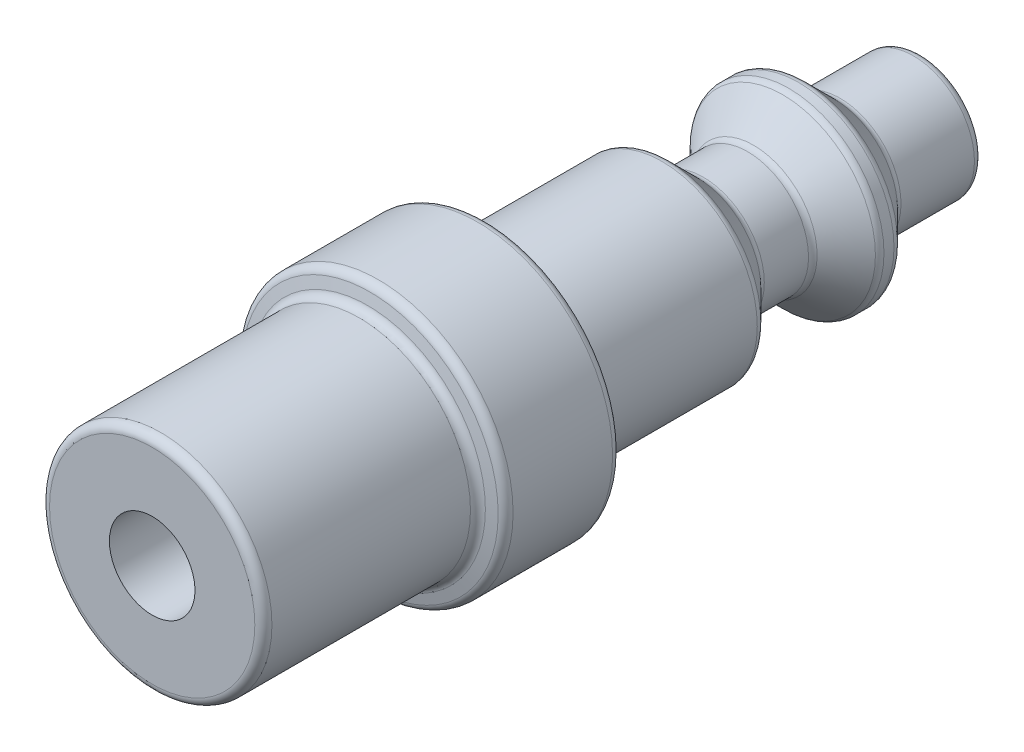
ISO-10303-21;
HEADER;
FILE_DESCRIPTION(('STEP AP214'),'2;1');
FILE_NAME('part.step','',(''),(''),'','','');
FILE_SCHEMA(('AUTOMOTIVE_DESIGN { 1 0 10303 214 1 1 1 1 }'));
ENDSEC;
DATA;
#1=APPLICATION_CONTEXT('core data for automotive mechanical design processes');
#2=APPLICATION_PROTOCOL_DEFINITION('international standard','automotive_design',2000,#1);
#3=PRODUCT_CONTEXT('',#1,'mechanical');
#4=PRODUCT('Part','Part','',(#3));
#5=PRODUCT_RELATED_PRODUCT_CATEGORY('part','',(#4));
#6=PRODUCT_DEFINITION_FORMATION('','',#4);
#7=PRODUCT_DEFINITION_CONTEXT('part definition',#1,'design');
#8=PRODUCT_DEFINITION('design','',#6,#7);
#9=PRODUCT_DEFINITION_SHAPE('','',#8);
#10=(LENGTH_UNIT() NAMED_UNIT(*) SI_UNIT(.MILLI.,.METRE.));
#11=(NAMED_UNIT(*) PLANE_ANGLE_UNIT() SI_UNIT($,.RADIAN.));
#12=(NAMED_UNIT(*) SI_UNIT($,.STERADIAN.) SOLID_ANGLE_UNIT());
#13=UNCERTAINTY_MEASURE_WITH_UNIT(LENGTH_MEASURE(1.E-05),#10,'distance_accuracy_value','');
#14=(GEOMETRIC_REPRESENTATION_CONTEXT(3) GLOBAL_UNCERTAINTY_ASSIGNED_CONTEXT((#13)) GLOBAL_UNIT_ASSIGNED_CONTEXT((#10,
#11,#12)) REPRESENTATION_CONTEXT('',''));
#15=CARTESIAN_POINT('',(0.,0.,0.));
#16=DIRECTION('',(0.,0.,1.));
#17=DIRECTION('',(1.,0.,0.));
#18=AXIS2_PLACEMENT_3D('',#15,#16,#17);
#19=CARTESIAN_POINT('',(0.,0.,7.99580693019013));
#20=DIRECTION('',(0.,0.,-1.));
#21=DIRECTION('',(-1.,0.,0.));
#22=AXIS2_PLACEMENT_3D('',#19,#20,#21);
#23=CONICAL_SURFACE('',#22,5.56374446089535,0.786447530482505);
#24=CARTESIAN_POINT('',(0.,0.,8.14231693281503));
#25=DIRECTION('',(0.,0.,1.));
#26=DIRECTION('',(1.,0.,0.));
#27=AXIS2_PLACEMENT_3D('',#24,#25,#26);
#28=CIRCLE('',#27,5.41692664960441);
#29=CARTESIAN_POINT('',(5.41692664960441,0.,8.14231693281503));
#30=VERTEX_POINT('',#29);
#31=EDGE_CURVE('E111',#30,#30,#28,.T.);
#32=ORIENTED_EDGE('',*,*,#31,.T.);
#33=EDGE_LOOP('',(#32));
#34=FACE_BOUND('',#33,.T.);
#35=CARTESIAN_POINT('',(0.,0.,9.84510385775535));
#36=DIRECTION('',(0.,0.,-1.));
#37=DIRECTION('',(-1.,0.,0.));
#38=AXIS2_PLACEMENT_3D('',#35,#36,#37);
#39=CIRCLE('',#38,3.71056227218628);
#40=CARTESIAN_POINT('',(-3.71056227218628,0.,9.84510385775535));
#41=VERTEX_POINT('',#40);
#42=EDGE_CURVE('E114',#41,#41,#39,.T.);
#43=ORIENTED_EDGE('',*,*,#42,.T.);
#44=EDGE_LOOP('',(#43));
#45=FACE_BOUND('',#44,.T.);
#46=ADVANCED_FACE('F37',(#34,#45),#23,.T.);
#47=CARTESIAN_POINT('',(0.,0.,45.));
#48=DIRECTION('',(0.,0.,1.));
#49=DIRECTION('',(1.,0.,0.));
#50=AXIS2_PLACEMENT_3D('',#47,#48,#49);
#51=CYLINDRICAL_SURFACE('',#50,3.56374446089535);
#52=CARTESIAN_POINT('',(0.,0.,12.7841996598505));
#53=DIRECTION('',(0.,0.,1.));
#54=DIRECTION('',(1.,0.,0.));
#55=AXIS2_PLACEMENT_3D('',#52,#53,#54);
#56=CIRCLE('',#55,3.56374446089535);
#57=CARTESIAN_POINT('',(3.56374446089535,0.,12.7841996598505));
#58=VERTEX_POINT('',#57);
#59=EDGE_CURVE('E44',#58,#58,#56,.F.);
#60=ORIENTED_EDGE('',*,*,#59,.T.);
#61=EDGE_LOOP('',(#60));
#62=FACE_BOUND('',#61,.T.);
#63=CARTESIAN_POINT('',(0.,0.,10.19902806091));
#64=DIRECTION('',(0.,0.,1.));
#65=DIRECTION('',(1.,0.,0.));
#66=AXIS2_PLACEMENT_3D('',#63,#64,#65);
#67=CIRCLE('',#66,3.56374446089535);
#68=CARTESIAN_POINT('',(3.56374446089535,0.,10.19902806091));
#69=VERTEX_POINT('',#68);
#70=EDGE_CURVE('E48',#69,#69,#67,.T.);
#71=ORIENTED_EDGE('',*,*,#70,.T.);
#72=EDGE_LOOP('',(#71));
#73=FACE_BOUND('',#72,.T.);
#74=ADVANCED_FACE('F150',(#62,#73),#51,.T.);
#75=CARTESIAN_POINT('',(0.,0.,12.9916138603803));
#76=DIRECTION('',(0.,0.,1.));
#77=DIRECTION('',(1.,0.,0.));
#78=AXIS2_PLACEMENT_3D('',#75,#76,#77);
#79=CONICAL_SURFACE('',#78,3.56374446089535,0.786447530482505);
#80=CARTESIAN_POINT('',(0.,0.,14.8409107879455));
#81=DIRECTION('',(0.,0.,-1.));
#82=DIRECTION('',(-1.,0.,0.));
#83=AXIS2_PLACEMENT_3D('',#80,#81,#82);
#84=CIRCLE('',#83,5.41692664960441);
#85=CARTESIAN_POINT('',(-5.41692664960441,0.,14.8409107879455));
#86=VERTEX_POINT('',#85);
#87=EDGE_CURVE('E52',#86,#86,#84,.T.);
#88=ORIENTED_EDGE('',*,*,#87,.T.);
#89=EDGE_LOOP('',(#88));
#90=FACE_BOUND('',#89,.T.);
#91=CARTESIAN_POINT('',(0.,0.,13.1381238630052));
#92=DIRECTION('',(0.,0.,1.));
#93=DIRECTION('',(1.,0.,0.));
#94=AXIS2_PLACEMENT_3D('',#91,#92,#93);
#95=CIRCLE('',#94,3.71056227218628);
#96=CARTESIAN_POINT('',(3.71056227218628,0.,13.1381238630052));
#97=VERTEX_POINT('',#96);
#98=EDGE_CURVE('E57',#97,#97,#95,.T.);
#99=ORIENTED_EDGE('',*,*,#98,.T.);
#100=EDGE_LOOP('',(#99));
#101=FACE_BOUND('',#100,.T.);
#102=ADVANCED_FACE('F156',(#90,#101),#79,.T.);
#103=CARTESIAN_POINT('',(0.,0.,45.));
#104=DIRECTION('',(0.,0.,1.));
#105=DIRECTION('',(1.,0.,0.));
#106=AXIS2_PLACEMENT_3D('',#103,#104,#105);
#107=CYLINDRICAL_SURFACE('',#106,5.56374446089534);
#108=CARTESIAN_POINT('',(0.,0.,24.5986161840766));
#109=DIRECTION('',(0.,0.,1.));
#110=DIRECTION('',(1.,0.,0.));
#111=AXIS2_PLACEMENT_3D('',#108,#109,#110);
#112=CIRCLE('',#111,5.56374446089534);
#113=CARTESIAN_POINT('',(5.56374446089534,0.,24.5986161840766));
#114=VERTEX_POINT('',#113);
#115=EDGE_CURVE('E60',#114,#114,#112,.F.);
#116=ORIENTED_EDGE('',*,*,#115,.T.);
#117=EDGE_LOOP('',(#116));
#118=FACE_BOUND('',#117,.T.);
#119=CARTESIAN_POINT('',(0.,0.,15.1948349911002));
#120=DIRECTION('',(0.,0.,-1.));
#121=DIRECTION('',(-1.,0.,0.));
#122=AXIS2_PLACEMENT_3D('',#119,#120,#121);
#123=CIRCLE('',#122,5.56374446089534);
#124=CARTESIAN_POINT('',(-5.56374446089534,0.,15.1948349911002));
#125=VERTEX_POINT('',#124);
#126=EDGE_CURVE('E63',#125,#125,#123,.F.);
#127=ORIENTED_EDGE('',*,*,#126,.T.);
#128=EDGE_LOOP('',(#127));
#129=FACE_BOUND('',#128,.T.);
#130=ADVANCED_FACE('F235',(#118,#129),#107,.T.);
#131=CARTESIAN_POINT('',(0.,0.,24.9874207905704));
#132=DIRECTION('',(0.,0.,1.));
#133=DIRECTION('',(1.,0.,0.));
#134=AXIS2_PLACEMENT_3D('',#131,#132,#133);
#135=CONICAL_SURFACE('',#134,5.56374446089535,1.32187626287963);
#136=CARTESIAN_POINT('',(0.,0.,25.4791382934745));
#137=DIRECTION('',(0.,0.,-1.));
#138=DIRECTION('',(-1.,0.,0.));
#139=AXIS2_PLACEMENT_3D('',#136,#137,#138);
#140=CIRCLE('',#139,7.49817872585093);
#141=CARTESIAN_POINT('',(-7.49817872585093,0.,25.4791382934745));
#142=VERTEX_POINT('',#141);
#143=EDGE_CURVE('E66',#142,#142,#140,.T.);
#144=ORIENTED_EDGE('',*,*,#143,.T.);
#145=EDGE_LOOP('',(#144));
#146=FACE_BOUND('',#145,.T.);
#147=CARTESIAN_POINT('',(0.,0.,25.0832057026361));
#148=DIRECTION('',(0.,0.,1.));
#149=DIRECTION('',(1.,0.,0.));
#150=AXIS2_PLACEMENT_3D('',#147,#148,#149);
#151=CIRCLE('',#150,5.94056573504441);
#152=CARTESIAN_POINT('',(5.94056573504441,0.,25.0832057026361));
#153=VERTEX_POINT('',#152);
#154=EDGE_CURVE('E69',#153,#153,#151,.T.);
#155=ORIENTED_EDGE('',*,*,#154,.T.);
#156=EDGE_LOOP('',(#155));
#157=FACE_BOUND('',#156,.T.);
#158=ADVANCED_FACE('F226',(#146,#157),#135,.T.);
#159=CARTESIAN_POINT('',(0.,0.,45.));
#160=DIRECTION('',(0.,0.,1.));
#161=DIRECTION('',(1.,0.,0.));
#162=AXIS2_PLACEMENT_3D('',#159,#160,#161);
#163=CYLINDRICAL_SURFACE('',#162,3.56374446089535);
#164=CARTESIAN_POINT('',(0.,0.,4.79258579947021));
#165=DIRECTION('',(0.,0.,1.));
#166=DIRECTION('',(1.,0.,0.));
#167=AXIS2_PLACEMENT_3D('',#164,#165,#166);
#168=CIRCLE('',#167,3.56374446089535);
#169=CARTESIAN_POINT('',(3.56374446089535,0.,4.79258579947021));
#170=VERTEX_POINT('',#169);
#171=EDGE_CURVE('E93',#170,#170,#168,.F.);
#172=ORIENTED_EDGE('',*,*,#171,.T.);
#173=EDGE_LOOP('',(#172));
#174=FACE_BOUND('',#173,.T.);
#175=CARTESIAN_POINT('',(0.,0.,0.5));
#176=DIRECTION('',(0.,0.,1.));
#177=DIRECTION('',(1.,0.,0.));
#178=AXIS2_PLACEMENT_3D('',#175,#176,#177);
#179=CIRCLE('',#178,3.56374446089535);
#180=CARTESIAN_POINT('',(3.56374446089535,0.,0.5));
#181=VERTEX_POINT('',#180);
#182=EDGE_CURVE('E96',#181,#181,#179,.T.);
#183=ORIENTED_EDGE('',*,*,#182,.T.);
#184=EDGE_LOOP('',(#183));
#185=FACE_BOUND('',#184,.T.);
#186=ADVANCED_FACE('F224',(#174,#185),#163,.T.);
#187=CARTESIAN_POINT('',(0.,0.,5.));
#188=DIRECTION('',(0.,0.,1.));
#189=DIRECTION('',(1.,0.,0.));
#190=AXIS2_PLACEMENT_3D('',#187,#188,#189);
#191=CONICAL_SURFACE('',#190,3.56374446089535,0.786447530482503);
#192=CARTESIAN_POINT('',(0.,0.,6.84929692756523));
#193=DIRECTION('',(0.,0.,-1.));
#194=DIRECTION('',(-1.,0.,0.));
#195=AXIS2_PLACEMENT_3D('',#192,#193,#194);
#196=CIRCLE('',#195,5.41692664960441);
#197=CARTESIAN_POINT('',(-5.41692664960441,0.,6.84929692756523));
#198=VERTEX_POINT('',#197);
#199=EDGE_CURVE('E99',#198,#198,#196,.T.);
#200=ORIENTED_EDGE('',*,*,#199,.T.);
#201=EDGE_LOOP('',(#200));
#202=FACE_BOUND('',#201,.T.);
#203=CARTESIAN_POINT('',(0.,0.,5.1465100026249));
#204=DIRECTION('',(0.,0.,1.));
#205=DIRECTION('',(1.,0.,0.));
#206=AXIS2_PLACEMENT_3D('',#203,#204,#205);
#207=CIRCLE('',#206,3.71056227218628);
#208=CARTESIAN_POINT('',(3.71056227218628,0.,5.1465100026249));
#209=VERTEX_POINT('',#208);
#210=EDGE_CURVE('E102',#209,#209,#207,.T.);
#211=ORIENTED_EDGE('',*,*,#210,.T.);
#212=EDGE_LOOP('',(#211));
#213=FACE_BOUND('',#212,.T.);
#214=ADVANCED_FACE('F145',(#202,#213),#191,.T.);
#215=CARTESIAN_POINT('',(0.,0.,45.));
#216=DIRECTION('',(0.,0.,1.));
#217=DIRECTION('',(1.,0.,0.));
#218=AXIS2_PLACEMENT_3D('',#215,#216,#217);
#219=CYLINDRICAL_SURFACE('',#218,5.56374446089534);
#220=CARTESIAN_POINT('',(0.,0.,7.78839272966034));
#221=DIRECTION('',(0.,0.,-1.));
#222=DIRECTION('',(-1.,0.,0.));
#223=AXIS2_PLACEMENT_3D('',#220,#221,#222);
#224=CIRCLE('',#223,5.56374446089534);
#225=CARTESIAN_POINT('',(-5.56374446089534,0.,7.78839272966034));
#226=VERTEX_POINT('',#225);
#227=EDGE_CURVE('E105',#226,#226,#224,.T.);
#228=ORIENTED_EDGE('',*,*,#227,.T.);
#229=EDGE_LOOP('',(#228));
#230=FACE_BOUND('',#229,.T.);
#231=CARTESIAN_POINT('',(0.,0.,7.20322113071991));
#232=DIRECTION('',(0.,0.,-1.));
#233=DIRECTION('',(-1.,0.,0.));
#234=AXIS2_PLACEMENT_3D('',#231,#232,#233);
#235=CIRCLE('',#234,5.56374446089534);
#236=CARTESIAN_POINT('',(-5.56374446089534,0.,7.20322113071991));
#237=VERTEX_POINT('',#236);
#238=EDGE_CURVE('E108',#237,#237,#235,.F.);
#239=ORIENTED_EDGE('',*,*,#238,.T.);
#240=EDGE_LOOP('',(#239));
#241=FACE_BOUND('',#240,.T.);
#242=ADVANCED_FACE('F136',(#230,#241),#219,.T.);
#243=CARTESIAN_POINT('',(0.,0.,0.));
#244=DIRECTION('',(0.,0.,1.));
#245=DIRECTION('',(1.,0.,0.));
#246=AXIS2_PLACEMENT_3D('',#243,#244,#245);
#247=PLANE('',#246);
#248=CARTESIAN_POINT('',(0.,0.,0.));
#249=DIRECTION('',(0.,0.,1.));
#250=DIRECTION('',(1.,0.,0.));
#251=AXIS2_PLACEMENT_3D('',#248,#249,#250);
#252=CIRCLE('',#251,3.06374446089535);
#253=CARTESIAN_POINT('',(3.06374446089535,0.,0.));
#254=VERTEX_POINT('',#253);
#255=EDGE_CURVE('E10',#254,#254,#252,.F.);
#256=ORIENTED_EDGE('',*,*,#255,.T.);
#257=EDGE_LOOP('',(#256));
#258=FACE_BOUND('',#257,.T.);
#259=CARTESIAN_POINT('',(0.,0.,0.));
#260=DIRECTION('',(0.,0.,-1.));
#261=DIRECTION('',(-1.,0.,0.));
#262=AXIS2_PLACEMENT_3D('',#259,#260,#261);
#263=CIRCLE('',#262,2.5);
#264=CARTESIAN_POINT('',(-2.5,0.,0.));
#265=VERTEX_POINT('',#264);
#266=EDGE_CURVE('E118',#265,#265,#263,.T.);
#267=ORIENTED_EDGE('',*,*,#266,.F.);
#268=EDGE_LOOP('',(#267));
#269=FACE_BOUND('',#268,.T.);
#270=ADVANCED_FACE('F133',(#258,#269),#247,.F.);
#271=CARTESIAN_POINT('',(0.,0.,45.));
#272=DIRECTION('',(0.,0.,-1.));
#273=DIRECTION('',(-1.,0.,0.));
#274=AXIS2_PLACEMENT_3D('',#271,#272,#273);
#275=CYLINDRICAL_SURFACE('',#274,7.875);
#276=CARTESIAN_POINT('',(0.,0.,31.7793493919796));
#277=DIRECTION('',(0.,0.,-1.));
#278=DIRECTION('',(-1.,0.,0.));
#279=AXIS2_PLACEMENT_3D('',#276,#277,#278);
#280=CIRCLE('',#279,7.875);
#281=CARTESIAN_POINT('',(-7.875,0.,31.7793493919796));
#282=VERTEX_POINT('',#281);
#283=EDGE_CURVE('E72',#282,#282,#280,.T.);
#284=CARTESIAN_POINT('',(0.,0.,25.963727812034));
#285=DIRECTION('',(0.,0.,-1.));
#286=DIRECTION('',(-1.,0.,0.));
#287=AXIS2_PLACEMENT_3D('',#284,#285,#286);
#288=CIRCLE('',#287,7.875);
#289=CARTESIAN_POINT('',(-7.875,0.,25.963727812034));
#290=VERTEX_POINT('',#289);
#291=EDGE_CURVE('E75',#290,#290,#288,.F.);
#292=CARTESIAN_POINT('',(-7.875,0.,31.7793493919796));
#293=CARTESIAN_POINT('',(-7.875,0.,31.7187700005219));
#294=CARTESIAN_POINT('',(-7.875,0.,31.6581906090641));
#295=CARTESIAN_POINT('',(-7.875,0.,31.5370318261486));
#296=CARTESIAN_POINT('',(-7.875,0.,31.4764524346908));
#297=CARTESIAN_POINT('',(-7.875,0.,31.3552936517753));
#298=CARTESIAN_POINT('',(-7.875,0.,31.2947142603175));
#299=CARTESIAN_POINT('',(-7.875,0.,31.173555477402));
#300=CARTESIAN_POINT('',(-7.875,0.,31.1129760859442));
#301=CARTESIAN_POINT('',(-7.875,0.,30.9918173030287));
#302=CARTESIAN_POINT('',(-7.875,0.,30.9312379115709));
#303=CARTESIAN_POINT('',(-7.875,0.,30.8100791286554));
#304=CARTESIAN_POINT('',(-7.875,0.,30.7494997371976));
#305=CARTESIAN_POINT('',(-7.875,0.,30.6283409542821));
#306=CARTESIAN_POINT('',(-7.875,0.,30.5677615628243));
#307=CARTESIAN_POINT('',(-7.875,0.,30.4466027799088));
#308=CARTESIAN_POINT('',(-7.875,0.,30.386023388451));
#309=CARTESIAN_POINT('',(-7.875,0.,30.2648646055355));
#310=CARTESIAN_POINT('',(-7.875,0.,30.2042852140777));
#311=CARTESIAN_POINT('',(-7.875,0.,30.0831264311622));
#312=CARTESIAN_POINT('',(-7.875,0.,30.0225470397044));
#313=CARTESIAN_POINT('',(-7.875,0.,29.9013882567889));
#314=CARTESIAN_POINT('',(-7.875,0.,29.8408088653311));
#315=CARTESIAN_POINT('',(-7.875,0.,29.7196500824156));
#316=CARTESIAN_POINT('',(-7.875,0.,29.6590706909578));
#317=CARTESIAN_POINT('',(-7.875,0.,29.5379119080423));
#318=CARTESIAN_POINT('',(-7.875,0.,29.4773325165845));
#319=CARTESIAN_POINT('',(-7.875,0.,29.356173733669));
#320=CARTESIAN_POINT('',(-7.875,0.,29.2955943422112));
#321=CARTESIAN_POINT('',(-7.875,0.,29.1744355592957));
#322=CARTESIAN_POINT('',(-7.875,0.,29.1138561678379));
#323=CARTESIAN_POINT('',(-7.875,0.,28.9926973849224));
#324=CARTESIAN_POINT('',(-7.875,0.,28.9321179934646));
#325=CARTESIAN_POINT('',(-7.875,0.,28.8109592105491));
#326=CARTESIAN_POINT('',(-7.875,0.,28.7503798190913));
#327=CARTESIAN_POINT('',(-7.875,0.,28.6292210361758));
#328=CARTESIAN_POINT('',(-7.875,0.,28.568641644718));
#329=CARTESIAN_POINT('',(-7.875,0.,28.4474828618025));
#330=CARTESIAN_POINT('',(-7.875,0.,28.3869034703447));
#331=CARTESIAN_POINT('',(-7.875,0.,28.2657446874292));
#332=CARTESIAN_POINT('',(-7.875,0.,28.2051652959714));
#333=CARTESIAN_POINT('',(-7.875,0.,28.0840065130559));
#334=CARTESIAN_POINT('',(-7.875,0.,28.0234271215981));
#335=CARTESIAN_POINT('',(-7.875,0.,27.9022683386826));
#336=CARTESIAN_POINT('',(-7.875,0.,27.8416889472248));
#337=CARTESIAN_POINT('',(-7.875,0.,27.7205301643093));
#338=CARTESIAN_POINT('',(-7.875,0.,27.6599507728515));
#339=CARTESIAN_POINT('',(-7.875,0.,27.538791989936));
#340=CARTESIAN_POINT('',(-7.875,0.,27.4782125984782));
#341=CARTESIAN_POINT('',(-7.875,0.,27.3570538155627));
#342=CARTESIAN_POINT('',(-7.875,0.,27.2964744241049));
#343=CARTESIAN_POINT('',(-7.875,0.,27.1753156411894));
#344=CARTESIAN_POINT('',(-7.875,0.,27.1147362497316));
#345=CARTESIAN_POINT('',(-7.875,0.,26.9935774668161));
#346=CARTESIAN_POINT('',(-7.875,0.,26.9329980753583));
#347=CARTESIAN_POINT('',(-7.875,0.,26.8118392924428));
#348=CARTESIAN_POINT('',(-7.875,0.,26.751259900985));
#349=CARTESIAN_POINT('',(-7.875,0.,26.6301011180695));
#350=CARTESIAN_POINT('',(-7.875,0.,26.5695217266117));
#351=CARTESIAN_POINT('',(-7.875,0.,26.4483629436962));
#352=CARTESIAN_POINT('',(-7.875,0.,26.3877835522384));
#353=CARTESIAN_POINT('',(-7.875,0.,26.2666247693229));
#354=CARTESIAN_POINT('',(-7.875,0.,26.2060453778651));
#355=CARTESIAN_POINT('',(-7.875,0.,26.0848865949496));
#356=CARTESIAN_POINT('',(-7.875,0.,26.0243072034918));
#357=CARTESIAN_POINT('',(-7.875,0.,25.963727812034));
#358=B_SPLINE_CURVE_WITH_KNOTS('',3,(#292,#293,#294,#295,#296,#297,#298,#299,#300,#301,#302,
#303,#304,#305,#306,#307,#308,#309,#310,#311,#312,#313,#314,#315,#316,#317,#318,#319,#320,#321,
#322,#323,#324,#325,#326,#327,#328,#329,#330,#331,#332,#333,#334,#335,#336,#337,#338,#339,#340,
#341,#342,#343,#344,#345,#346,#347,#348,#349,#350,#351,#352,#353,#354,#355,#356,#357),
.UNSPECIFIED.,.F.,.F.,(4,2,2,2,2,2,2,2,2,2,2,2,2,2,2,2,2,2,2,2,2,2,2,2,2,2,2,2,2,2,2,2,4),(0.,
0.181738174373301,0.363476348746603,0.545214523119904,0.726952697493202,0.908690871866499,
1.0904290462398,1.2721672206131,1.4539053949864,1.6356435693597,1.817381743733,1.9991199181063,
2.1808580924796,2.3625962668529,2.5443344412262,2.7260726155995,2.9078107899728,3.0895489643461,
3.2712871387194,3.4530253130927,3.634763487466,3.8165016618393,3.9982398362126,4.1799780105859,
4.36171618495919,4.5434543593325,4.72519253370579,4.9069307080791,5.0886688824524,
5.27040705682569,5.452145231199,5.63388340557229,5.81562157994559),.UNSPECIFIED.);
#359=EDGE_CURVE('BSEAM135',#282,#290,#358,.T.);
#360=ORIENTED_EDGE('',*,*,#283,.T.);
#361=ORIENTED_EDGE('',*,*,#291,.T.);
#362=ORIENTED_EDGE('',*,*,#359,.T.);
#363=ORIENTED_EDGE('',*,*,#359,.F.);
#364=EDGE_LOOP('',(#360,#362,#361,#363));
#365=FACE_BOUND('',#364,.T.);
#366=ADVANCED_FACE('F135',(#365),#275,.T.);
#367=CARTESIAN_POINT('',(0.,0.,45.));
#368=DIRECTION('',(0.,0.,1.));
#369=DIRECTION('',(1.,0.,0.));
#370=AXIS2_PLACEMENT_3D('',#367,#368,#369);
#371=CYLINDRICAL_SURFACE('',#370,6.5);
#372=CARTESIAN_POINT('',(0.,0.,44.5));
#373=DIRECTION('',(0.,0.,1.));
#374=DIRECTION('',(1.,0.,0.));
#375=AXIS2_PLACEMENT_3D('',#372,#373,#374);
#376=CIRCLE('',#375,6.5);
#377=CARTESIAN_POINT('',(6.5,0.,44.5));
#378=VERTEX_POINT('',#377);
#379=EDGE_CURVE('E84',#378,#378,#376,.F.);
#380=ORIENTED_EDGE('',*,*,#379,.T.);
#381=EDGE_LOOP('',(#380));
#382=FACE_BOUND('',#381,.T.);
#383=CARTESIAN_POINT('',(0.,0.,32.8955738135606));
#384=DIRECTION('',(0.,0.,1.));
#385=DIRECTION('',(1.,0.,0.));
#386=AXIS2_PLACEMENT_3D('',#383,#384,#385);
#387=CIRCLE('',#386,6.5);
#388=CARTESIAN_POINT('',(6.5,0.,32.8955738135606));
#389=VERTEX_POINT('',#388);
#390=EDGE_CURVE('E87',#389,#389,#387,.T.);
#391=ORIENTED_EDGE('',*,*,#390,.T.);
#392=EDGE_LOOP('',(#391));
#393=FACE_BOUND('',#392,.T.);
#394=ADVANCED_FACE('F142',(#382,#393),#371,.T.);
#395=CARTESIAN_POINT('',(0.,0.,32.1749232055403));
#396=DIRECTION('',(0.,0.,-1.));
#397=DIRECTION('',(-1.,0.,0.));
#398=AXIS2_PLACEMENT_3D('',#395,#396,#397);
#399=CONICAL_SURFACE('',#398,7.875,1.33863959401122);
#400=CARTESIAN_POINT('',(0.,0.,32.4089875914178));
#401=DIRECTION('',(0.,0.,-1.));
#402=DIRECTION('',(-1.,0.,0.));
#403=AXIS2_PLACEMENT_3D('',#400,#401,#402);
#404=CIRCLE('',#403,6.88496153503821);
#405=CARTESIAN_POINT('',(-6.88496153503821,0.,32.4089875914178));
#406=VERTEX_POINT('',#405);
#407=EDGE_CURVE('E78',#406,#406,#404,.T.);
#408=ORIENTED_EDGE('',*,*,#407,.T.);
#409=EDGE_LOOP('',(#408));
#410=FACE_BOUND('',#409,.T.);
#411=CARTESIAN_POINT('',(0.,0.,32.2659356141225));
#412=DIRECTION('',(0.,0.,1.));
#413=DIRECTION('',(1.,0.,0.));
#414=AXIS2_PLACEMENT_3D('',#411,#412,#413);
#415=CIRCLE('',#414,7.49003846496179);
#416=CARTESIAN_POINT('',(7.49003846496179,0.,32.2659356141225));
#417=VERTEX_POINT('',#416);
#418=EDGE_CURVE('E81',#417,#417,#415,.T.);
#419=ORIENTED_EDGE('',*,*,#418,.T.);
#420=EDGE_LOOP('',(#419));
#421=FACE_BOUND('',#420,.T.);
#422=ADVANCED_FACE('F161',(#410,#421),#399,.T.);
#423=CARTESIAN_POINT('',(0.,0.,45.));
#424=DIRECTION('',(0.,0.,1.));
#425=DIRECTION('',(1.,0.,0.));
#426=AXIS2_PLACEMENT_3D('',#423,#424,#425);
#427=PLANE('',#426);
#428=CARTESIAN_POINT('',(0.,0.,45.));
#429=DIRECTION('',(0.,0.,1.));
#430=DIRECTION('',(1.,0.,0.));
#431=AXIS2_PLACEMENT_3D('',#428,#429,#430);
#432=CIRCLE('',#431,6.);
#433=CARTESIAN_POINT('',(6.,0.,45.));
#434=VERTEX_POINT('',#433);
#435=EDGE_CURVE('E90',#434,#434,#432,.T.);
#436=ORIENTED_EDGE('',*,*,#435,.T.);
#437=EDGE_LOOP('',(#436));
#438=FACE_BOUND('',#437,.T.);
#439=CARTESIAN_POINT('',(0.,0.,45.));
#440=DIRECTION('',(0.,0.,-1.));
#441=DIRECTION('',(-1.,0.,0.));
#442=AXIS2_PLACEMENT_3D('',#439,#440,#441);
#443=CIRCLE('',#442,2.5);
#444=CARTESIAN_POINT('',(-2.5,0.,45.));
#445=VERTEX_POINT('',#444);
#446=EDGE_CURVE('E117',#445,#445,#443,.T.);
#447=ORIENTED_EDGE('',*,*,#446,.T.);
#448=EDGE_LOOP('',(#447));
#449=FACE_BOUND('',#448,.T.);
#450=ADVANCED_FACE('F124',(#438,#449),#427,.T.);
#451=CARTESIAN_POINT('',(0.,0.,45.));
#452=DIRECTION('',(0.,0.,-1.));
#453=DIRECTION('',(-1.,0.,0.));
#454=AXIS2_PLACEMENT_3D('',#451,#452,#453);
#455=CYLINDRICAL_SURFACE('',#454,2.5);
#456=CARTESIAN_POINT('',(-2.5,0.,45.));
#457=CARTESIAN_POINT('',(-2.5,0.,44.53125));
#458=CARTESIAN_POINT('',(-2.5,0.,44.0625));
#459=CARTESIAN_POINT('',(-2.5,0.,43.125));
#460=CARTESIAN_POINT('',(-2.5,0.,42.65625));
#461=CARTESIAN_POINT('',(-2.5,0.,41.71875));
#462=CARTESIAN_POINT('',(-2.5,0.,41.25));
#463=CARTESIAN_POINT('',(-2.5,0.,40.3125));
#464=CARTESIAN_POINT('',(-2.5,0.,39.84375));
#465=CARTESIAN_POINT('',(-2.5,0.,38.90625));
#466=CARTESIAN_POINT('',(-2.5,0.,38.4375));
#467=CARTESIAN_POINT('',(-2.5,0.,37.5));
#468=CARTESIAN_POINT('',(-2.5,0.,37.03125));
#469=CARTESIAN_POINT('',(-2.5,0.,36.09375));
#470=CARTESIAN_POINT('',(-2.5,0.,35.625));
#471=CARTESIAN_POINT('',(-2.5,0.,34.6875));
#472=CARTESIAN_POINT('',(-2.5,0.,34.21875));
#473=CARTESIAN_POINT('',(-2.5,0.,33.28125));
#474=CARTESIAN_POINT('',(-2.5,0.,32.8125));
#475=CARTESIAN_POINT('',(-2.5,0.,31.875));
#476=CARTESIAN_POINT('',(-2.5,0.,31.40625));
#477=CARTESIAN_POINT('',(-2.5,0.,30.46875));
#478=CARTESIAN_POINT('',(-2.5,0.,30.));
#479=CARTESIAN_POINT('',(-2.5,0.,29.0625));
#480=CARTESIAN_POINT('',(-2.5,0.,28.59375));
#481=CARTESIAN_POINT('',(-2.5,0.,27.65625));
#482=CARTESIAN_POINT('',(-2.5,0.,27.1875));
#483=CARTESIAN_POINT('',(-2.5,0.,26.25));
#484=CARTESIAN_POINT('',(-2.5,0.,25.78125));
#485=CARTESIAN_POINT('',(-2.5,0.,24.84375));
#486=CARTESIAN_POINT('',(-2.5,0.,24.375));
#487=CARTESIAN_POINT('',(-2.5,0.,23.4375));
#488=CARTESIAN_POINT('',(-2.5,0.,22.96875));
#489=CARTESIAN_POINT('',(-2.5,0.,22.03125));
#490=CARTESIAN_POINT('',(-2.5,0.,21.5625));
#491=CARTESIAN_POINT('',(-2.5,0.,20.625));
#492=CARTESIAN_POINT('',(-2.5,0.,20.15625));
#493=CARTESIAN_POINT('',(-2.5,0.,19.21875));
#494=CARTESIAN_POINT('',(-2.5,0.,18.75));
#495=CARTESIAN_POINT('',(-2.5,0.,17.8125));
#496=CARTESIAN_POINT('',(-2.5,0.,17.34375));
#497=CARTESIAN_POINT('',(-2.5,0.,16.40625));
#498=CARTESIAN_POINT('',(-2.5,0.,15.9375));
#499=CARTESIAN_POINT('',(-2.5,0.,15.));
#500=CARTESIAN_POINT('',(-2.5,0.,14.53125));
#501=CARTESIAN_POINT('',(-2.5,0.,13.59375));
#502=CARTESIAN_POINT('',(-2.5,0.,13.125));
#503=CARTESIAN_POINT('',(-2.5,0.,12.1875));
#504=CARTESIAN_POINT('',(-2.5,0.,11.71875));
#505=CARTESIAN_POINT('',(-2.5,0.,10.78125));
#506=CARTESIAN_POINT('',(-2.5,0.,10.3125));
#507=CARTESIAN_POINT('',(-2.5,0.,9.37500000000001));
#508=CARTESIAN_POINT('',(-2.5,0.,8.90625000000001));
#509=CARTESIAN_POINT('',(-2.5,0.,7.96875000000001));
#510=CARTESIAN_POINT('',(-2.5,0.,7.50000000000001));
#511=CARTESIAN_POINT('',(-2.5,0.,6.56250000000001));
#512=CARTESIAN_POINT('',(-2.5,0.,6.09375000000001));
#513=CARTESIAN_POINT('',(-2.5,0.,5.15625000000001));
#514=CARTESIAN_POINT('',(-2.5,0.,4.68750000000001));
#515=CARTESIAN_POINT('',(-2.5,0.,3.75000000000001));
#516=CARTESIAN_POINT('',(-2.5,0.,3.28125000000001));
#517=CARTESIAN_POINT('',(-2.5,0.,2.34375000000001));
#518=CARTESIAN_POINT('',(-2.5,0.,1.87500000000001));
#519=CARTESIAN_POINT('',(-2.5,0.,0.937500000000006));
#520=CARTESIAN_POINT('',(-2.5,0.,0.468750000000007));
#521=CARTESIAN_POINT('',(-2.5,0.,0.));
#522=B_SPLINE_CURVE_WITH_KNOTS('',3,(#456,#457,#458,#459,#460,#461,#462,#463,#464,#465,#466,
#467,#468,#469,#470,#471,#472,#473,#474,#475,#476,#477,#478,#479,#480,#481,#482,#483,#484,#485,
#486,#487,#488,#489,#490,#491,#492,#493,#494,#495,#496,#497,#498,#499,#500,#501,#502,#503,#504,
#505,#506,#507,#508,#509,#510,#511,#512,#513,#514,#515,#516,#517,#518,#519,#520,#521),
.UNSPECIFIED.,.F.,.F.,(4,2,2,2,2,2,2,2,2,2,2,2,2,2,2,2,2,2,2,2,2,2,2,2,2,2,2,2,2,2,2,2,4),(0.,
1.40625,2.8125,4.21875,5.62500000000001,7.03125,8.4375,9.84375000000001,11.25,12.65625,14.0625,
15.46875,16.875,18.28125,19.6875,21.09375,22.5,23.90625,25.3125,26.71875,28.125,29.53125,
30.9375,32.34375,33.75,35.15625,36.5625,37.96875,39.375,40.78125,42.1875,43.59375,45.),.UNSPECIFIED.);
#523=EDGE_CURVE('BSEAM126',#445,#265,#522,.T.);
#524=ORIENTED_EDGE('',*,*,#446,.F.);
#525=ORIENTED_EDGE('',*,*,#266,.T.);
#526=ORIENTED_EDGE('',*,*,#523,.T.);
#527=ORIENTED_EDGE('',*,*,#523,.F.);
#528=EDGE_LOOP('',(#524,#526,#525,#527));
#529=FACE_BOUND('',#528,.T.);
#530=ADVANCED_FACE('F126',(#529),#455,.F.);
#531=CARTESIAN_POINT('',(0.,0.,7.78839272966034));
#532=DIRECTION('',(0.,0.,-1.));
#533=DIRECTION('',(-1.,0.,0.));
#534=AXIS2_PLACEMENT_3D('',#531,#532,#533);
#535=TOROIDAL_SURFACE('',#534,5.06374446089534,0.5);
#536=ORIENTED_EDGE('',*,*,#227,.F.);
#537=EDGE_LOOP('',(#536));
#538=FACE_BOUND('',#537,.T.);
#539=ORIENTED_EDGE('',*,*,#31,.F.);
#540=EDGE_LOOP('',(#539));
#541=FACE_BOUND('',#540,.T.);
#542=ADVANCED_FACE('F129',(#538,#541),#535,.T.);
#543=CARTESIAN_POINT('',(0.,0.,7.20322113071991));
#544=DIRECTION('',(0.,0.,-1.));
#545=DIRECTION('',(-1.,0.,0.));
#546=AXIS2_PLACEMENT_3D('',#543,#544,#545);
#547=TOROIDAL_SURFACE('',#546,5.06374446089534,0.5);
#548=ORIENTED_EDGE('',*,*,#199,.F.);
#549=EDGE_LOOP('',(#548));
#550=FACE_BOUND('',#549,.T.);
#551=ORIENTED_EDGE('',*,*,#238,.F.);
#552=EDGE_LOOP('',(#551));
#553=FACE_BOUND('',#552,.T.);
#554=ADVANCED_FACE('F184',(#550,#553),#547,.T.);
#555=CARTESIAN_POINT('',(0.,0.,4.79258579947021));
#556=DIRECTION('',(0.,0.,1.));
#557=DIRECTION('',(1.,0.,0.));
#558=AXIS2_PLACEMENT_3D('',#555,#556,#557);
#559=TOROIDAL_SURFACE('',#558,4.06374446089535,0.5);
#560=ORIENTED_EDGE('',*,*,#171,.F.);
#561=EDGE_LOOP('',(#560));
#562=FACE_BOUND('',#561,.T.);
#563=ORIENTED_EDGE('',*,*,#210,.F.);
#564=EDGE_LOOP('',(#563));
#565=FACE_BOUND('',#564,.T.);
#566=ADVANCED_FACE('F174',(#562,#565),#559,.F.);
#567=CARTESIAN_POINT('',(0.,0.,44.5));
#568=DIRECTION('',(0.,0.,1.));
#569=DIRECTION('',(1.,0.,0.));
#570=AXIS2_PLACEMENT_3D('',#567,#568,#569);
#571=TOROIDAL_SURFACE('',#570,6.,0.5);
#572=ORIENTED_EDGE('',*,*,#379,.F.);
#573=EDGE_LOOP('',(#572));
#574=FACE_BOUND('',#573,.T.);
#575=ORIENTED_EDGE('',*,*,#435,.F.);
#576=EDGE_LOOP('',(#575));
#577=FACE_BOUND('',#576,.T.);
#578=ADVANCED_FACE('F171',(#574,#577),#571,.T.);
#579=CARTESIAN_POINT('',(0.,0.,32.8955738135606));
#580=DIRECTION('',(0.,0.,1.));
#581=DIRECTION('',(1.,0.,0.));
#582=AXIS2_PLACEMENT_3D('',#579,#580,#581);
#583=TOROIDAL_SURFACE('',#582,7.,0.5);
#584=ORIENTED_EDGE('',*,*,#407,.F.);
#585=EDGE_LOOP('',(#584));
#586=FACE_BOUND('',#585,.T.);
#587=ORIENTED_EDGE('',*,*,#390,.F.);
#588=EDGE_LOOP('',(#587));
#589=FACE_BOUND('',#588,.T.);
#590=ADVANCED_FACE('F173',(#586,#589),#583,.F.);
#591=CARTESIAN_POINT('',(0.,0.,31.7793493919796));
#592=DIRECTION('',(0.,0.,-1.));
#593=DIRECTION('',(-1.,0.,0.));
#594=AXIS2_PLACEMENT_3D('',#591,#592,#593);
#595=TOROIDAL_SURFACE('',#594,7.375,0.5);
#596=ORIENTED_EDGE('',*,*,#283,.F.);
#597=EDGE_LOOP('',(#596));
#598=FACE_BOUND('',#597,.T.);
#599=ORIENTED_EDGE('',*,*,#418,.F.);
#600=EDGE_LOOP('',(#599));
#601=FACE_BOUND('',#600,.T.);
#602=ADVANCED_FACE('F181',(#598,#601),#595,.T.);
#603=CARTESIAN_POINT('',(0.,0.,25.963727812034));
#604=DIRECTION('',(0.,0.,-1.));
#605=DIRECTION('',(-1.,0.,0.));
#606=AXIS2_PLACEMENT_3D('',#603,#604,#605);
#607=TOROIDAL_SURFACE('',#606,7.375,0.5);
#608=ORIENTED_EDGE('',*,*,#143,.F.);
#609=EDGE_LOOP('',(#608));
#610=FACE_BOUND('',#609,.T.);
#611=ORIENTED_EDGE('',*,*,#291,.F.);
#612=EDGE_LOOP('',(#611));
#613=FACE_BOUND('',#612,.T.);
#614=ADVANCED_FACE('F192',(#610,#613),#607,.T.);
#615=CARTESIAN_POINT('',(0.,0.,24.5986161840766));
#616=DIRECTION('',(0.,0.,1.));
#617=DIRECTION('',(1.,0.,0.));
#618=AXIS2_PLACEMENT_3D('',#615,#616,#617);
#619=TOROIDAL_SURFACE('',#618,6.06374446089535,0.5);
#620=ORIENTED_EDGE('',*,*,#115,.F.);
#621=EDGE_LOOP('',(#620));
#622=FACE_BOUND('',#621,.T.);
#623=ORIENTED_EDGE('',*,*,#154,.F.);
#624=EDGE_LOOP('',(#623));
#625=FACE_BOUND('',#624,.T.);
#626=ADVANCED_FACE('F196',(#622,#625),#619,.F.);
#627=CARTESIAN_POINT('',(0.,0.,15.1948349911002));
#628=DIRECTION('',(0.,0.,-1.));
#629=DIRECTION('',(-1.,0.,0.));
#630=AXIS2_PLACEMENT_3D('',#627,#628,#629);
#631=TOROIDAL_SURFACE('',#630,5.06374446089534,0.5);
#632=ORIENTED_EDGE('',*,*,#87,.F.);
#633=EDGE_LOOP('',(#632));
#634=FACE_BOUND('',#633,.T.);
#635=ORIENTED_EDGE('',*,*,#126,.F.);
#636=EDGE_LOOP('',(#635));
#637=FACE_BOUND('',#636,.T.);
#638=ADVANCED_FACE('F200',(#634,#637),#631,.T.);
#639=CARTESIAN_POINT('',(0.,0.,12.7841996598505));
#640=DIRECTION('',(0.,0.,1.));
#641=DIRECTION('',(1.,0.,0.));
#642=AXIS2_PLACEMENT_3D('',#639,#640,#641);
#643=TOROIDAL_SURFACE('',#642,4.06374446089535,0.5);
#644=ORIENTED_EDGE('',*,*,#59,.F.);
#645=EDGE_LOOP('',(#644));
#646=FACE_BOUND('',#645,.T.);
#647=ORIENTED_EDGE('',*,*,#98,.F.);
#648=EDGE_LOOP('',(#647));
#649=FACE_BOUND('',#648,.T.);
#650=ADVANCED_FACE('F204',(#646,#649),#643,.F.);
#651=CARTESIAN_POINT('',(0.,0.,10.19902806091));
#652=DIRECTION('',(0.,0.,1.));
#653=DIRECTION('',(1.,0.,0.));
#654=AXIS2_PLACEMENT_3D('',#651,#652,#653);
#655=TOROIDAL_SURFACE('',#654,4.06374446089535,0.5);
#656=ORIENTED_EDGE('',*,*,#42,.F.);
#657=EDGE_LOOP('',(#656));
#658=FACE_BOUND('',#657,.T.);
#659=ORIENTED_EDGE('',*,*,#70,.F.);
#660=EDGE_LOOP('',(#659));
#661=FACE_BOUND('',#660,.T.);
#662=ADVANCED_FACE('F207',(#658,#661),#655,.F.);
#663=CARTESIAN_POINT('',(0.,0.,0.5));
#664=DIRECTION('',(0.,0.,1.));
#665=DIRECTION('',(1.,0.,0.));
#666=AXIS2_PLACEMENT_3D('',#663,#664,#665);
#667=TOROIDAL_SURFACE('',#666,3.06374446089535,0.5);
#668=ORIENTED_EDGE('',*,*,#255,.F.);
#669=EDGE_LOOP('',(#668));
#670=FACE_BOUND('',#669,.T.);
#671=ORIENTED_EDGE('',*,*,#182,.F.);
#672=EDGE_LOOP('',(#671));
#673=FACE_BOUND('',#672,.T.);
#674=ADVANCED_FACE('F39',(#670,#673),#667,.T.);
#675=CLOSED_SHELL('',(#46,#74,#102,#130,#158,#186,#214,#242,#270,#366,#394,#422,#450,#530,#542,
#554,#566,#578,#590,#602,#614,#626,#638,#650,#662,#674));
#676=MANIFOLD_SOLID_BREP('B2',#675);
#677=ADVANCED_BREP_SHAPE_REPRESENTATION('',(#18,#676),#14);
#678=SHAPE_DEFINITION_REPRESENTATION(#9,#677);
ENDSEC;
END-ISO-10303-21;
